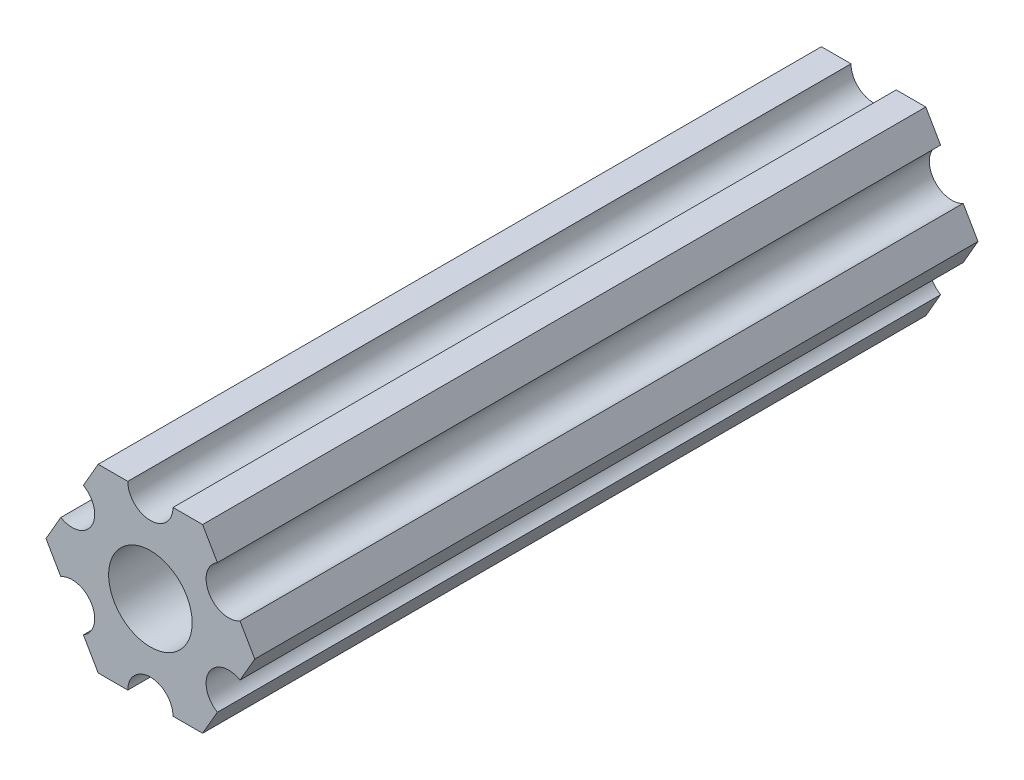
ISO-10303-21;
HEADER;
FILE_DESCRIPTION(('STEP AP214'),'2;1');
FILE_NAME('part.step','',(''),(''),'','','');
FILE_SCHEMA(('AUTOMOTIVE_DESIGN { 1 0 10303 214 1 1 1 1 }'));
ENDSEC;
DATA;
#1=APPLICATION_CONTEXT('core data for automotive mechanical design processes');
#2=APPLICATION_PROTOCOL_DEFINITION('international standard','automotive_design',2000,#1);
#3=PRODUCT_CONTEXT('',#1,'mechanical');
#4=PRODUCT('Part','Part','',(#3));
#5=PRODUCT_RELATED_PRODUCT_CATEGORY('part','',(#4));
#6=PRODUCT_DEFINITION_FORMATION('','',#4);
#7=PRODUCT_DEFINITION_CONTEXT('part definition',#1,'design');
#8=PRODUCT_DEFINITION('design','',#6,#7);
#9=PRODUCT_DEFINITION_SHAPE('','',#8);
#10=(LENGTH_UNIT() NAMED_UNIT(*) SI_UNIT(.MILLI.,.METRE.));
#11=(NAMED_UNIT(*) PLANE_ANGLE_UNIT() SI_UNIT($,.RADIAN.));
#12=(NAMED_UNIT(*) SI_UNIT($,.STERADIAN.) SOLID_ANGLE_UNIT());
#13=UNCERTAINTY_MEASURE_WITH_UNIT(LENGTH_MEASURE(1.E-05),#10,'distance_accuracy_value','');
#14=(GEOMETRIC_REPRESENTATION_CONTEXT(3) GLOBAL_UNCERTAINTY_ASSIGNED_CONTEXT((#13)) GLOBAL_UNIT_ASSIGNED_CONTEXT((#10,
#11,#12)) REPRESENTATION_CONTEXT('',''));
#15=CARTESIAN_POINT('',(0.,0.,0.));
#16=DIRECTION('',(0.,0.,1.));
#17=DIRECTION('',(1.,0.,0.));
#18=AXIS2_PLACEMENT_3D('',#15,#16,#17);
#19=CARTESIAN_POINT('',(5.49926150638083,-3.17499966684068,-50.8));
#20=DIRECTION('',(0.,0.,1.));
#21=DIRECTION('',(1.,0.,0.));
#22=AXIS2_PLACEMENT_3D('',#19,#20,#21);
#23=PLANE('',#22);
#24=CARTESIAN_POINT('',(5.49926150638083,-3.17499966684068,-50.8));
#25=DIRECTION('',(0.,0.,1.));
#26=DIRECTION('',(1.,0.,0.));
#27=AXIS2_PLACEMENT_3D('',#24,#25,#26);
#28=CIRCLE('',#27,1.58750000000001);
#29=CARTESIAN_POINT('',(6.29301142309098,-1.80018429024546,-50.8));
#30=VERTEX_POINT('',#29);
#31=CARTESIAN_POINT('',(4.70551158967068,-4.54981504343589,-50.8));
#32=VERTEX_POINT('',#31);
#33=EDGE_CURVE('E225',#30,#32,#28,.T.);
#34=ORIENTED_EDGE('',*,*,#33,.T.);
#35=DIRECTION('',(-0.499999947533953,-0.866025434075723,0.));
#36=VECTOR('',#35,1.);
#37=CARTESIAN_POINT('',(4.70551158967068,-4.54981504343589,-50.8));
#38=LINE('',#37,#36);
#39=CARTESIAN_POINT('',(3.66617452134693,-6.34999990382519,-50.8));
#40=VERTEX_POINT('',#39);
#41=EDGE_CURVE('E123',#32,#40,#38,.T.);
#42=ORIENTED_EDGE('',*,*,#41,.T.);
#43=DIRECTION('',(-1.,0.,0.));
#44=VECTOR('',#43,1.);
#45=CARTESIAN_POINT('',(3.66617452134693,-6.34999990382519,-50.8));
#46=LINE('',#45,#44);
#47=CARTESIAN_POINT('',(1.58750038469926,-6.34999990382518,-50.8));
#48=VERTEX_POINT('',#47);
#49=EDGE_CURVE('E270',#40,#48,#46,.T.);
#50=ORIENTED_EDGE('',*,*,#49,.T.);
#51=CARTESIAN_POINT('',(3.8469926204343E-07,-6.34999990382519,-50.8));
#52=DIRECTION('',(0.,0.,1.));
#53=DIRECTION('',(1.,0.,0.));
#54=AXIS2_PLACEMENT_3D('',#51,#52,#53);
#55=CIRCLE('',#54,1.5875);
#56=CARTESIAN_POINT('',(-1.58749961530074,-6.34999990382519,-50.8));
#57=VERTEX_POINT('',#56);
#58=EDGE_CURVE('E289',#48,#57,#55,.T.);
#59=ORIENTED_EDGE('',*,*,#58,.T.);
#60=DIRECTION('',(-1.,0.,0.));
#61=VECTOR('',#60,1.);
#62=CARTESIAN_POINT('',(-1.58749961530074,-6.34999990382519,-50.8));
#63=LINE('',#62,#61);
#64=CARTESIAN_POINT('',(-3.66617382465481,-6.34999990382519,-50.8));
#65=VERTEX_POINT('',#64);
#66=EDGE_CURVE('E286',#57,#65,#63,.T.);
#67=ORIENTED_EDGE('',*,*,#66,.T.);
#68=DIRECTION('',(-0.5,0.866025403784439,0.));
#69=VECTOR('',#68,1.);
#70=CARTESIAN_POINT('',(-3.66617382465481,-6.34999990382519,-50.8));
#71=LINE('',#70,#69);
#72=CARTESIAN_POINT('',(-4.70551092933191,-4.54981523233291,-50.8));
#73=VERTEX_POINT('',#72);
#74=EDGE_CURVE('E288',#65,#73,#71,.T.);
#75=ORIENTED_EDGE('',*,*,#74,.T.);
#76=CARTESIAN_POINT('',(-5.49926092933191,-3.17499990382512,-50.8));
#77=DIRECTION('',(0.,0.,1.));
#78=DIRECTION('',(1.,0.,0.));
#79=AXIS2_PLACEMENT_3D('',#76,#77,#78);
#80=CIRCLE('',#79,1.5875);
#81=CARTESIAN_POINT('',(-6.29301092933191,-1.80018457531732,-50.8));
#82=VERTEX_POINT('',#81);
#83=EDGE_CURVE('E291',#73,#82,#80,.T.);
#84=ORIENTED_EDGE('',*,*,#83,.T.);
#85=DIRECTION('',(-0.5,0.866025403784438,0.));
#86=VECTOR('',#85,1.);
#87=CARTESIAN_POINT('',(-6.29301092933191,-1.80018457531732,-50.8));
#88=LINE('',#87,#86);
#89=CARTESIAN_POINT('',(-7.33234803400895,9.61748368946088E-08,-50.8));
#90=VERTEX_POINT('',#89);
#91=EDGE_CURVE('E297',#82,#90,#88,.T.);
#92=ORIENTED_EDGE('',*,*,#91,.T.);
#93=DIRECTION('',(0.499999921300922,0.866025449221368,0.));
#94=VECTOR('',#93,1.);
#95=CARTESIAN_POINT('',(-7.33234803400895,9.61748368946088E-08,-50.8));
#96=LINE('',#95,#94);
#97=CARTESIAN_POINT('',(-6.29301117773375,1.80018471521667,-50.8));
#98=VERTEX_POINT('',#97);
#99=EDGE_CURVE('E299',#90,#98,#96,.T.);
#100=ORIENTED_EDGE('',*,*,#99,.T.);
#101=CARTESIAN_POINT('',(-5.49926130266854,3.1750001158556,-50.8));
#102=DIRECTION('',(0.,0.,1.));
#103=DIRECTION('',(1.,0.,0.));
#104=AXIS2_PLACEMENT_3D('',#101,#102,#103);
#105=CIRCLE('',#104,1.5875);
#106=CARTESIAN_POINT('',(-4.70551142760333,4.54981551649452,-50.8));
#107=VERTEX_POINT('',#106);
#108=EDGE_CURVE('E301',#98,#107,#105,.T.);
#109=ORIENTED_EDGE('',*,*,#108,.T.);
#110=DIRECTION('',(0.499999921300922,0.866025449221368,0.));
#111=VECTOR('',#110,1.);
#112=CARTESIAN_POINT('',(-4.70551142760333,4.54981551649452,-50.8));
#113=LINE('',#112,#111);
#114=CARTESIAN_POINT('',(-3.66617452134701,6.35000022210623,-50.8));
#115=VERTEX_POINT('',#114);
#116=EDGE_CURVE('E303',#107,#115,#113,.T.);
#117=ORIENTED_EDGE('',*,*,#116,.T.);
#118=DIRECTION('',(1.,0.,0.));
#119=VECTOR('',#118,1.);
#120=CARTESIAN_POINT('',(-3.66617452134701,6.35000022210623,-50.8));
#121=LINE('',#120,#119);
#122=CARTESIAN_POINT('',(-1.58750038469935,6.35000022210623,-50.8));
#123=VERTEX_POINT('',#122);
#124=EDGE_CURVE('E305',#115,#123,#121,.T.);
#125=ORIENTED_EDGE('',*,*,#124,.T.);
#126=CARTESIAN_POINT('',(-3.84699344941095E-07,6.35000022210623,-50.8));
#127=DIRECTION('',(0.,0.,1.));
#128=DIRECTION('',(1.,0.,0.));
#129=AXIS2_PLACEMENT_3D('',#126,#127,#128);
#130=CIRCLE('',#129,1.5875);
#131=CARTESIAN_POINT('',(1.58749961530066,6.35000022210623,-50.8));
#132=VERTEX_POINT('',#131);
#133=EDGE_CURVE('E307',#123,#132,#130,.T.);
#134=ORIENTED_EDGE('',*,*,#133,.T.);
#135=DIRECTION('',(1.,0.,0.));
#136=VECTOR('',#135,1.);
#137=CARTESIAN_POINT('',(1.58749961530066,6.35000022210623,-50.8));
#138=LINE('',#137,#136);
#139=CARTESIAN_POINT('',(3.66617382465472,6.35000022210622,-50.8));
#140=VERTEX_POINT('',#139);
#141=EDGE_CURVE('E309',#132,#140,#138,.T.);
#142=ORIENTED_EDGE('',*,*,#141,.T.);
#143=DIRECTION('',(0.500000052466056,-0.866025373493145,0.));
#144=VECTOR('',#143,1.);
#145=CARTESIAN_POINT('',(3.66617382465472,6.35000022210622,-50.8));
#146=LINE('',#145,#144);
#147=CARTESIAN_POINT('',(4.70551103839166,4.54981561357968,-50.8));
#148=VERTEX_POINT('',#147);
#149=EDGE_CURVE('E172',#140,#148,#146,.T.);
#150=ORIENTED_EDGE('',*,*,#149,.T.);
#151=CARTESIAN_POINT('',(5.49926112168152,3.17500033315931,-50.8));
#152=DIRECTION('',(0.,0.,1.));
#153=DIRECTION('',(1.,0.,0.));
#154=AXIS2_PLACEMENT_3D('',#151,#152,#153);
#155=CIRCLE('',#154,1.5875);
#156=CARTESIAN_POINT('',(6.29301120497139,1.80018505273895,-50.8));
#157=VERTEX_POINT('',#156);
#158=EDGE_CURVE('E166',#148,#157,#155,.T.);
#159=ORIENTED_EDGE('',*,*,#158,.T.);
#160=DIRECTION('',(0.500000052466056,-0.866025373493145,0.));
#161=VECTOR('',#160,1.);
#162=CARTESIAN_POINT('',(6.29301120497139,1.80018505273895,-50.8));
#163=LINE('',#162,#161);
#164=CARTESIAN_POINT('',(7.33234841870826,4.44212518856872E-07,-50.8));
#165=VERTEX_POINT('',#164);
#166=EDGE_CURVE('E170',#157,#165,#163,.T.);
#167=ORIENTED_EDGE('',*,*,#166,.T.);
#168=DIRECTION('',(-0.499999947533953,-0.866025434075723,0.));
#169=VECTOR('',#168,1.);
#170=CARTESIAN_POINT('',(7.33234841870826,4.44212518856872E-07,-50.8));
#171=LINE('',#170,#169);
#172=EDGE_CURVE('E50',#165,#30,#171,.T.);
#173=ORIENTED_EDGE('',*,*,#172,.T.);
#174=EDGE_LOOP('',(#34,#42,#50,#59,#67,#75,#84,#92,#100,#109,#117,#125,#134,#142,#150,#159,#167,#173));
#175=FACE_BOUND('',#174,.T.);
#176=CARTESIAN_POINT('',(0.,0.,-50.8));
#177=DIRECTION('',(0.,0.,-1.));
#178=DIRECTION('',(1.,0.,0.));
#179=AXIS2_PLACEMENT_3D('',#176,#177,#178);
#180=CIRCLE('',#179,2.9337);
#181=CARTESIAN_POINT('',(2.9337,0.,-50.8));
#182=VERTEX_POINT('',#181);
#183=EDGE_CURVE('E194',#182,#182,#180,.T.);
#184=ORIENTED_EDGE('',*,*,#183,.F.);
#185=EDGE_LOOP('',(#184));
#186=FACE_BOUND('',#185,.T.);
#187=ADVANCED_FACE('F33',(#175,#186),#23,.F.);
#188=CARTESIAN_POINT('',(5.49926150638083,-3.17499966684068,0.));
#189=DIRECTION('',(0.,0.,1.));
#190=DIRECTION('',(1.,0.,0.));
#191=AXIS2_PLACEMENT_3D('',#188,#189,#190);
#192=PLANE('',#191);
#193=CARTESIAN_POINT('',(5.49926150638083,-3.17499966684068,0.));
#194=DIRECTION('',(0.,0.,1.));
#195=DIRECTION('',(1.,0.,0.));
#196=AXIS2_PLACEMENT_3D('',#193,#194,#195);
#197=CIRCLE('',#196,1.58750000000001);
#198=CARTESIAN_POINT('',(6.29301142309098,-1.80018429024546,0.));
#199=VERTEX_POINT('',#198);
#200=CARTESIAN_POINT('',(4.70551158967068,-4.54981504343589,0.));
#201=VERTEX_POINT('',#200);
#202=EDGE_CURVE('E190',#199,#201,#197,.T.);
#203=ORIENTED_EDGE('',*,*,#202,.F.);
#204=DIRECTION('',(-0.499999947533953,-0.866025434075723,0.));
#205=VECTOR('',#204,1.);
#206=CARTESIAN_POINT('',(7.33234841870826,4.44212518856872E-07,0.));
#207=LINE('',#206,#205);
#208=CARTESIAN_POINT('',(7.33234841870826,4.44212518856872E-07,0.));
#209=VERTEX_POINT('',#208);
#210=EDGE_CURVE('E115',#209,#199,#207,.T.);
#211=ORIENTED_EDGE('',*,*,#210,.F.);
#212=DIRECTION('',(0.500000052466056,-0.866025373493145,0.));
#213=VECTOR('',#212,1.);
#214=CARTESIAN_POINT('',(6.29301120497139,1.80018505273895,0.));
#215=LINE('',#214,#213);
#216=CARTESIAN_POINT('',(6.29301120497139,1.80018505273895,0.));
#217=VERTEX_POINT('',#216);
#218=EDGE_CURVE('E109',#217,#209,#215,.T.);
#219=ORIENTED_EDGE('',*,*,#218,.F.);
#220=CARTESIAN_POINT('',(5.49926112168152,3.17500033315931,0.));
#221=DIRECTION('',(0.,0.,1.));
#222=DIRECTION('',(1.,0.,0.));
#223=AXIS2_PLACEMENT_3D('',#220,#221,#222);
#224=CIRCLE('',#223,1.5875);
#225=CARTESIAN_POINT('',(4.70551103839166,4.54981561357968,0.));
#226=VERTEX_POINT('',#225);
#227=EDGE_CURVE('E180',#226,#217,#224,.T.);
#228=ORIENTED_EDGE('',*,*,#227,.F.);
#229=DIRECTION('',(0.500000052466056,-0.866025373493145,0.));
#230=VECTOR('',#229,1.);
#231=CARTESIAN_POINT('',(3.66617382465472,6.35000022210622,0.));
#232=LINE('',#231,#230);
#233=CARTESIAN_POINT('',(3.66617382465472,6.35000022210622,0.));
#234=VERTEX_POINT('',#233);
#235=EDGE_CURVE('E220',#234,#226,#232,.T.);
#236=ORIENTED_EDGE('',*,*,#235,.F.);
#237=DIRECTION('',(1.,0.,0.));
#238=VECTOR('',#237,1.);
#239=CARTESIAN_POINT('',(1.58749961530066,6.35000022210623,0.));
#240=LINE('',#239,#238);
#241=CARTESIAN_POINT('',(1.58749961530066,6.35000022210623,0.));
#242=VERTEX_POINT('',#241);
#243=EDGE_CURVE('E218',#242,#234,#240,.T.);
#244=ORIENTED_EDGE('',*,*,#243,.F.);
#245=CARTESIAN_POINT('',(-3.84699344941095E-07,6.35000022210623,0.));
#246=DIRECTION('',(0.,0.,1.));
#247=DIRECTION('',(1.,0.,0.));
#248=AXIS2_PLACEMENT_3D('',#245,#246,#247);
#249=CIRCLE('',#248,1.5875);
#250=CARTESIAN_POINT('',(-1.58750038469935,6.35000022210623,0.));
#251=VERTEX_POINT('',#250);
#252=EDGE_CURVE('E216',#251,#242,#249,.T.);
#253=ORIENTED_EDGE('',*,*,#252,.F.);
#254=DIRECTION('',(1.,0.,0.));
#255=VECTOR('',#254,1.);
#256=CARTESIAN_POINT('',(-3.66617452134701,6.35000022210623,0.));
#257=LINE('',#256,#255);
#258=CARTESIAN_POINT('',(-3.66617452134701,6.35000022210623,0.));
#259=VERTEX_POINT('',#258);
#260=EDGE_CURVE('E214',#259,#251,#257,.T.);
#261=ORIENTED_EDGE('',*,*,#260,.F.);
#262=DIRECTION('',(0.499999921300922,0.866025449221368,0.));
#263=VECTOR('',#262,1.);
#264=CARTESIAN_POINT('',(-4.70551142760333,4.54981551649452,0.));
#265=LINE('',#264,#263);
#266=CARTESIAN_POINT('',(-4.70551142760333,4.54981551649452,0.));
#267=VERTEX_POINT('',#266);
#268=EDGE_CURVE('E212',#267,#259,#265,.T.);
#269=ORIENTED_EDGE('',*,*,#268,.F.);
#270=CARTESIAN_POINT('',(-5.49926130266854,3.1750001158556,0.));
#271=DIRECTION('',(0.,0.,1.));
#272=DIRECTION('',(1.,0.,0.));
#273=AXIS2_PLACEMENT_3D('',#270,#271,#272);
#274=CIRCLE('',#273,1.5875);
#275=CARTESIAN_POINT('',(-6.29301117773375,1.80018471521667,0.));
#276=VERTEX_POINT('',#275);
#277=EDGE_CURVE('E210',#276,#267,#274,.T.);
#278=ORIENTED_EDGE('',*,*,#277,.F.);
#279=DIRECTION('',(0.499999921300922,0.866025449221368,0.));
#280=VECTOR('',#279,1.);
#281=CARTESIAN_POINT('',(-7.33234803400895,9.61748368946088E-08,0.));
#282=LINE('',#281,#280);
#283=CARTESIAN_POINT('',(-7.33234803400895,9.61748368946088E-08,0.));
#284=VERTEX_POINT('',#283);
#285=EDGE_CURVE('E208',#284,#276,#282,.T.);
#286=ORIENTED_EDGE('',*,*,#285,.F.);
#287=DIRECTION('',(-0.5,0.866025403784438,0.));
#288=VECTOR('',#287,1.);
#289=CARTESIAN_POINT('',(-6.29301092933191,-1.80018457531732,0.));
#290=LINE('',#289,#288);
#291=CARTESIAN_POINT('',(-6.29301092933191,-1.80018457531732,0.));
#292=VERTEX_POINT('',#291);
#293=EDGE_CURVE('E206',#292,#284,#290,.T.);
#294=ORIENTED_EDGE('',*,*,#293,.F.);
#295=CARTESIAN_POINT('',(-5.49926092933191,-3.17499990382512,0.));
#296=DIRECTION('',(0.,0.,1.));
#297=DIRECTION('',(1.,0.,0.));
#298=AXIS2_PLACEMENT_3D('',#295,#296,#297);
#299=CIRCLE('',#298,1.5875);
#300=CARTESIAN_POINT('',(-4.70551092933191,-4.54981523233291,0.));
#301=VERTEX_POINT('',#300);
#302=EDGE_CURVE('E204',#301,#292,#299,.T.);
#303=ORIENTED_EDGE('',*,*,#302,.F.);
#304=DIRECTION('',(-0.5,0.866025403784439,0.));
#305=VECTOR('',#304,1.);
#306=CARTESIAN_POINT('',(-3.66617382465481,-6.34999990382519,0.));
#307=LINE('',#306,#305);
#308=CARTESIAN_POINT('',(-3.66617382465481,-6.34999990382519,0.));
#309=VERTEX_POINT('',#308);
#310=EDGE_CURVE('E202',#309,#301,#307,.T.);
#311=ORIENTED_EDGE('',*,*,#310,.F.);
#312=DIRECTION('',(-1.,0.,0.));
#313=VECTOR('',#312,1.);
#314=CARTESIAN_POINT('',(-1.58749961530074,-6.34999990382519,0.));
#315=LINE('',#314,#313);
#316=CARTESIAN_POINT('',(-1.58749961530074,-6.34999990382519,0.));
#317=VERTEX_POINT('',#316);
#318=EDGE_CURVE('E200',#317,#309,#315,.T.);
#319=ORIENTED_EDGE('',*,*,#318,.F.);
#320=CARTESIAN_POINT('',(3.8469926204343E-07,-6.34999990382519,0.));
#321=DIRECTION('',(0.,0.,1.));
#322=DIRECTION('',(1.,0.,0.));
#323=AXIS2_PLACEMENT_3D('',#320,#321,#322);
#324=CIRCLE('',#323,1.5875);
#325=CARTESIAN_POINT('',(1.58750038469926,-6.34999990382518,0.));
#326=VERTEX_POINT('',#325);
#327=EDGE_CURVE('E198',#326,#317,#324,.T.);
#328=ORIENTED_EDGE('',*,*,#327,.F.);
#329=DIRECTION('',(-1.,0.,0.));
#330=VECTOR('',#329,1.);
#331=CARTESIAN_POINT('',(3.66617452134693,-6.34999990382519,0.));
#332=LINE('',#331,#330);
#333=CARTESIAN_POINT('',(3.66617452134693,-6.34999990382519,0.));
#334=VERTEX_POINT('',#333);
#335=EDGE_CURVE('E196',#334,#326,#332,.T.);
#336=ORIENTED_EDGE('',*,*,#335,.F.);
#337=DIRECTION('',(-0.499999947533953,-0.866025434075723,0.));
#338=VECTOR('',#337,1.);
#339=CARTESIAN_POINT('',(4.70551158967068,-4.54981504343589,0.));
#340=LINE('',#339,#338);
#341=EDGE_CURVE('E193',#201,#334,#340,.T.);
#342=ORIENTED_EDGE('',*,*,#341,.F.);
#343=EDGE_LOOP('',(#203,#211,#219,#228,#236,#244,#253,#261,#269,#278,#286,#294,#303,#311,#319,
#328,#336,#342));
#344=FACE_BOUND('',#343,.T.);
#345=CARTESIAN_POINT('',(0.,0.,0.));
#346=DIRECTION('',(0.,0.,-1.));
#347=DIRECTION('',(1.,0.,0.));
#348=AXIS2_PLACEMENT_3D('',#345,#346,#347);
#349=CIRCLE('',#348,2.9337);
#350=CARTESIAN_POINT('',(2.9337,0.,0.));
#351=VERTEX_POINT('',#350);
#352=EDGE_CURVE('E534',#351,#351,#349,.T.);
#353=ORIENTED_EDGE('',*,*,#352,.T.);
#354=EDGE_LOOP('',(#353));
#355=FACE_BOUND('',#354,.T.);
#356=ADVANCED_FACE('F274',(#344,#355),#192,.T.);
#357=CARTESIAN_POINT('',(5.49926150638083,-3.17499966684068,-50.8));
#358=DIRECTION('',(0.,0.,1.));
#359=DIRECTION('',(1.,0.,0.));
#360=AXIS2_PLACEMENT_3D('',#357,#358,#359);
#361=CYLINDRICAL_SURFACE('',#360,1.58750000000001);
#362=ORIENTED_EDGE('',*,*,#202,.T.);
#363=DIRECTION('',(0.,0.,1.));
#364=VECTOR('',#363,1.);
#365=CARTESIAN_POINT('',(4.70551158967068,-4.54981504343589,-50.8));
#366=LINE('',#365,#364);
#367=EDGE_CURVE('E11',#32,#201,#366,.T.);
#368=ORIENTED_EDGE('',*,*,#367,.F.);
#369=ORIENTED_EDGE('',*,*,#33,.F.);
#370=DIRECTION('',(0.,0.,1.));
#371=VECTOR('',#370,1.);
#372=CARTESIAN_POINT('',(6.29301142309098,-1.80018429024546,-50.8));
#373=LINE('',#372,#371);
#374=EDGE_CURVE('E186',#30,#199,#373,.T.);
#375=ORIENTED_EDGE('',*,*,#374,.T.);
#376=EDGE_LOOP('',(#362,#368,#369,#375));
#377=FACE_BOUND('',#376,.T.);
#378=ADVANCED_FACE('F35',(#377),#361,.F.);
#379=CARTESIAN_POINT('',(4.70551158967068,-4.54981504343589,-50.8));
#380=DIRECTION('',(-0.866025434075723,0.499999947533953,0.));
#381=DIRECTION('',(-0.499999947533953,-0.866025434075723,0.));
#382=AXIS2_PLACEMENT_3D('',#379,#380,#381);
#383=PLANE('',#382);
#384=ORIENTED_EDGE('',*,*,#341,.T.);
#385=DIRECTION('',(0.,0.,1.));
#386=VECTOR('',#385,1.);
#387=CARTESIAN_POINT('',(3.66617452134693,-6.34999990382519,-50.8));
#388=LINE('',#387,#386);
#389=EDGE_CURVE('E42',#40,#334,#388,.T.);
#390=ORIENTED_EDGE('',*,*,#389,.F.);
#391=ORIENTED_EDGE('',*,*,#41,.F.);
#392=ORIENTED_EDGE('',*,*,#367,.T.);
#393=EDGE_LOOP('',(#384,#390,#391,#392));
#394=FACE_BOUND('',#393,.T.);
#395=ADVANCED_FACE('F343',(#394),#383,.F.);
#396=CARTESIAN_POINT('',(3.66617452134693,-6.34999990382519,-50.8));
#397=DIRECTION('',(0.,1.,0.));
#398=DIRECTION('',(-1.,0.,0.));
#399=AXIS2_PLACEMENT_3D('',#396,#397,#398);
#400=PLANE('',#399);
#401=ORIENTED_EDGE('',*,*,#335,.T.);
#402=DIRECTION('',(0.,0.,1.));
#403=VECTOR('',#402,1.);
#404=CARTESIAN_POINT('',(1.58750038469926,-6.34999990382518,-50.8));
#405=LINE('',#404,#403);
#406=EDGE_CURVE('E262',#48,#326,#405,.T.);
#407=ORIENTED_EDGE('',*,*,#406,.F.);
#408=ORIENTED_EDGE('',*,*,#49,.F.);
#409=ORIENTED_EDGE('',*,*,#389,.T.);
#410=EDGE_LOOP('',(#401,#407,#408,#409));
#411=FACE_BOUND('',#410,.T.);
#412=ADVANCED_FACE('F268',(#411),#400,.F.);
#413=CARTESIAN_POINT('',(3.8469926204343E-07,-6.34999990382519,-50.8));
#414=DIRECTION('',(0.,0.,1.));
#415=DIRECTION('',(1.,0.,0.));
#416=AXIS2_PLACEMENT_3D('',#413,#414,#415);
#417=CYLINDRICAL_SURFACE('',#416,1.5875);
#418=ORIENTED_EDGE('',*,*,#327,.T.);
#419=DIRECTION('',(0.,0.,1.));
#420=VECTOR('',#419,1.);
#421=CARTESIAN_POINT('',(-1.58749961530074,-6.34999990382519,-50.8));
#422=LINE('',#421,#420);
#423=EDGE_CURVE('E259',#57,#317,#422,.T.);
#424=ORIENTED_EDGE('',*,*,#423,.F.);
#425=ORIENTED_EDGE('',*,*,#58,.F.);
#426=ORIENTED_EDGE('',*,*,#406,.T.);
#427=EDGE_LOOP('',(#418,#424,#425,#426));
#428=FACE_BOUND('',#427,.T.);
#429=ADVANCED_FACE('F280',(#428),#417,.F.);
#430=CARTESIAN_POINT('',(-1.58749961530074,-6.34999990382519,-50.8));
#431=DIRECTION('',(0.,1.,0.));
#432=DIRECTION('',(-1.,0.,0.));
#433=AXIS2_PLACEMENT_3D('',#430,#431,#432);
#434=PLANE('',#433);
#435=ORIENTED_EDGE('',*,*,#318,.T.);
#436=DIRECTION('',(0.,0.,1.));
#437=VECTOR('',#436,1.);
#438=CARTESIAN_POINT('',(-3.66617382465481,-6.34999990382519,-50.8));
#439=LINE('',#438,#437);
#440=EDGE_CURVE('E256',#65,#309,#439,.T.);
#441=ORIENTED_EDGE('',*,*,#440,.F.);
#442=ORIENTED_EDGE('',*,*,#66,.F.);
#443=ORIENTED_EDGE('',*,*,#423,.T.);
#444=EDGE_LOOP('',(#435,#441,#442,#443));
#445=FACE_BOUND('',#444,.T.);
#446=ADVANCED_FACE('F284',(#445),#434,.F.);
#447=CARTESIAN_POINT('',(-3.66617382465481,-6.34999990382519,-50.8));
#448=DIRECTION('',(0.866025403784438,0.5,0.));
#449=DIRECTION('',(-0.5,0.866025403784439,0.));
#450=AXIS2_PLACEMENT_3D('',#447,#448,#449);
#451=PLANE('',#450);
#452=ORIENTED_EDGE('',*,*,#310,.T.);
#453=DIRECTION('',(0.,0.,1.));
#454=VECTOR('',#453,1.);
#455=CARTESIAN_POINT('',(-4.70551092933191,-4.54981523233291,-50.8));
#456=LINE('',#455,#454);
#457=EDGE_CURVE('E253',#73,#301,#456,.T.);
#458=ORIENTED_EDGE('',*,*,#457,.F.);
#459=ORIENTED_EDGE('',*,*,#74,.F.);
#460=ORIENTED_EDGE('',*,*,#440,.T.);
#461=EDGE_LOOP('',(#452,#458,#459,#460));
#462=FACE_BOUND('',#461,.T.);
#463=ADVANCED_FACE('F356',(#462),#451,.F.);
#464=CARTESIAN_POINT('',(-5.49926092933191,-3.17499990382512,-50.8));
#465=DIRECTION('',(0.,0.,1.));
#466=DIRECTION('',(1.,0.,0.));
#467=AXIS2_PLACEMENT_3D('',#464,#465,#466);
#468=CYLINDRICAL_SURFACE('',#467,1.5875);
#469=ORIENTED_EDGE('',*,*,#302,.T.);
#470=DIRECTION('',(0.,0.,1.));
#471=VECTOR('',#470,1.);
#472=CARTESIAN_POINT('',(-6.29301092933191,-1.80018457531732,-50.8));
#473=LINE('',#472,#471);
#474=EDGE_CURVE('E250',#82,#292,#473,.T.);
#475=ORIENTED_EDGE('',*,*,#474,.F.);
#476=ORIENTED_EDGE('',*,*,#83,.F.);
#477=ORIENTED_EDGE('',*,*,#457,.T.);
#478=EDGE_LOOP('',(#469,#475,#476,#477));
#479=FACE_BOUND('',#478,.T.);
#480=ADVANCED_FACE('F359',(#479),#468,.F.);
#481=CARTESIAN_POINT('',(-6.29301092933191,-1.80018457531732,-50.8));
#482=DIRECTION('',(0.866025403784438,0.5,0.));
#483=DIRECTION('',(-0.5,0.866025403784438,0.));
#484=AXIS2_PLACEMENT_3D('',#481,#482,#483);
#485=PLANE('',#484);
#486=ORIENTED_EDGE('',*,*,#293,.T.);
#487=DIRECTION('',(0.,0.,1.));
#488=VECTOR('',#487,1.);
#489=CARTESIAN_POINT('',(-7.33234803400895,9.61748368946088E-08,-50.8));
#490=LINE('',#489,#488);
#491=EDGE_CURVE('E247',#90,#284,#490,.T.);
#492=ORIENTED_EDGE('',*,*,#491,.F.);
#493=ORIENTED_EDGE('',*,*,#91,.F.);
#494=ORIENTED_EDGE('',*,*,#474,.T.);
#495=EDGE_LOOP('',(#486,#492,#493,#494));
#496=FACE_BOUND('',#495,.T.);
#497=ADVANCED_FACE('F363',(#496),#485,.F.);
#498=CARTESIAN_POINT('',(-7.33234803400895,9.61748368946088E-08,-50.8));
#499=DIRECTION('',(0.866025449221368,-0.499999921300922,0.));
#500=DIRECTION('',(0.499999921300922,0.866025449221368,0.));
#501=AXIS2_PLACEMENT_3D('',#498,#499,#500);
#502=PLANE('',#501);
#503=ORIENTED_EDGE('',*,*,#285,.T.);
#504=DIRECTION('',(0.,0.,1.));
#505=VECTOR('',#504,1.);
#506=CARTESIAN_POINT('',(-6.29301117773375,1.80018471521667,-50.8));
#507=LINE('',#506,#505);
#508=EDGE_CURVE('E244',#98,#276,#507,.T.);
#509=ORIENTED_EDGE('',*,*,#508,.F.);
#510=ORIENTED_EDGE('',*,*,#99,.F.);
#511=ORIENTED_EDGE('',*,*,#491,.T.);
#512=EDGE_LOOP('',(#503,#509,#510,#511));
#513=FACE_BOUND('',#512,.T.);
#514=ADVANCED_FACE('F367',(#513),#502,.F.);
#515=CARTESIAN_POINT('',(-5.49926130266854,3.1750001158556,-50.8));
#516=DIRECTION('',(0.,0.,1.));
#517=DIRECTION('',(1.,0.,0.));
#518=AXIS2_PLACEMENT_3D('',#515,#516,#517);
#519=CYLINDRICAL_SURFACE('',#518,1.5875);
#520=ORIENTED_EDGE('',*,*,#277,.T.);
#521=DIRECTION('',(0.,0.,1.));
#522=VECTOR('',#521,1.);
#523=CARTESIAN_POINT('',(-4.70551142760333,4.54981551649452,-50.8));
#524=LINE('',#523,#522);
#525=EDGE_CURVE('E241',#107,#267,#524,.T.);
#526=ORIENTED_EDGE('',*,*,#525,.F.);
#527=ORIENTED_EDGE('',*,*,#108,.F.);
#528=ORIENTED_EDGE('',*,*,#508,.T.);
#529=EDGE_LOOP('',(#520,#526,#527,#528));
#530=FACE_BOUND('',#529,.T.);
#531=ADVANCED_FACE('F371',(#530),#519,.F.);
#532=CARTESIAN_POINT('',(-4.70551142760333,4.54981551649452,-50.8));
#533=DIRECTION('',(0.866025449221368,-0.499999921300922,0.));
#534=DIRECTION('',(0.499999921300922,0.866025449221368,0.));
#535=AXIS2_PLACEMENT_3D('',#532,#533,#534);
#536=PLANE('',#535);
#537=ORIENTED_EDGE('',*,*,#268,.T.);
#538=DIRECTION('',(0.,0.,1.));
#539=VECTOR('',#538,1.);
#540=CARTESIAN_POINT('',(-3.66617452134701,6.35000022210623,-50.8));
#541=LINE('',#540,#539);
#542=EDGE_CURVE('E238',#115,#259,#541,.T.);
#543=ORIENTED_EDGE('',*,*,#542,.F.);
#544=ORIENTED_EDGE('',*,*,#116,.F.);
#545=ORIENTED_EDGE('',*,*,#525,.T.);
#546=EDGE_LOOP('',(#537,#543,#544,#545));
#547=FACE_BOUND('',#546,.T.);
#548=ADVANCED_FACE('F375',(#547),#536,.F.);
#549=CARTESIAN_POINT('',(-3.66617452134701,6.35000022210623,-50.8));
#550=DIRECTION('',(0.,-1.,0.));
#551=DIRECTION('',(0.,0.,-1.));
#552=AXIS2_PLACEMENT_3D('',#549,#550,#551);
#553=PLANE('',#552);
#554=ORIENTED_EDGE('',*,*,#260,.T.);
#555=DIRECTION('',(0.,0.,1.));
#556=VECTOR('',#555,1.);
#557=CARTESIAN_POINT('',(-1.58750038469935,6.35000022210623,-50.8));
#558=LINE('',#557,#556);
#559=EDGE_CURVE('E235',#123,#251,#558,.T.);
#560=ORIENTED_EDGE('',*,*,#559,.F.);
#561=ORIENTED_EDGE('',*,*,#124,.F.);
#562=ORIENTED_EDGE('',*,*,#542,.T.);
#563=EDGE_LOOP('',(#554,#560,#561,#562));
#564=FACE_BOUND('',#563,.T.);
#565=ADVANCED_FACE('F379',(#564),#553,.F.);
#566=CARTESIAN_POINT('',(-3.84699344941095E-07,6.35000022210623,-50.8));
#567=DIRECTION('',(0.,0.,1.));
#568=DIRECTION('',(1.,0.,0.));
#569=AXIS2_PLACEMENT_3D('',#566,#567,#568);
#570=CYLINDRICAL_SURFACE('',#569,1.5875);
#571=ORIENTED_EDGE('',*,*,#252,.T.);
#572=DIRECTION('',(0.,0.,1.));
#573=VECTOR('',#572,1.);
#574=CARTESIAN_POINT('',(1.58749961530066,6.35000022210623,-50.8));
#575=LINE('',#574,#573);
#576=EDGE_CURVE('E232',#132,#242,#575,.T.);
#577=ORIENTED_EDGE('',*,*,#576,.F.);
#578=ORIENTED_EDGE('',*,*,#133,.F.);
#579=ORIENTED_EDGE('',*,*,#559,.T.);
#580=EDGE_LOOP('',(#571,#577,#578,#579));
#581=FACE_BOUND('',#580,.T.);
#582=ADVANCED_FACE('F383',(#581),#570,.F.);
#583=CARTESIAN_POINT('',(1.58749961530066,6.35000022210623,-50.8));
#584=DIRECTION('',(0.,-1.,0.));
#585=DIRECTION('',(1.,0.,0.));
#586=AXIS2_PLACEMENT_3D('',#583,#584,#585);
#587=PLANE('',#586);
#588=ORIENTED_EDGE('',*,*,#243,.T.);
#589=DIRECTION('',(0.,0.,1.));
#590=VECTOR('',#589,1.);
#591=CARTESIAN_POINT('',(3.66617382465472,6.35000022210622,-50.8));
#592=LINE('',#591,#590);
#593=EDGE_CURVE('E229',#140,#234,#592,.T.);
#594=ORIENTED_EDGE('',*,*,#593,.F.);
#595=ORIENTED_EDGE('',*,*,#141,.F.);
#596=ORIENTED_EDGE('',*,*,#576,.T.);
#597=EDGE_LOOP('',(#588,#594,#595,#596));
#598=FACE_BOUND('',#597,.T.);
#599=ADVANCED_FACE('F315',(#598),#587,.F.);
#600=CARTESIAN_POINT('',(3.66617382465472,6.35000022210622,-50.8));
#601=DIRECTION('',(-0.866025373493145,-0.500000052466056,0.));
#602=DIRECTION('',(0.500000052466056,-0.866025373493145,0.));
#603=AXIS2_PLACEMENT_3D('',#600,#601,#602);
#604=PLANE('',#603);
#605=ORIENTED_EDGE('',*,*,#235,.T.);
#606=DIRECTION('',(0.,0.,1.));
#607=VECTOR('',#606,1.);
#608=CARTESIAN_POINT('',(4.70551103839166,4.54981561357968,-50.8));
#609=LINE('',#608,#607);
#610=EDGE_CURVE('E181',#148,#226,#609,.T.);
#611=ORIENTED_EDGE('',*,*,#610,.F.);
#612=ORIENTED_EDGE('',*,*,#149,.F.);
#613=ORIENTED_EDGE('',*,*,#593,.T.);
#614=EDGE_LOOP('',(#605,#611,#612,#613));
#615=FACE_BOUND('',#614,.T.);
#616=ADVANCED_FACE('F319',(#615),#604,.F.);
#617=CARTESIAN_POINT('',(5.49926112168152,3.17500033315931,-50.8));
#618=DIRECTION('',(0.,0.,1.));
#619=DIRECTION('',(1.,0.,0.));
#620=AXIS2_PLACEMENT_3D('',#617,#618,#619);
#621=CYLINDRICAL_SURFACE('',#620,1.5875);
#622=ORIENTED_EDGE('',*,*,#227,.T.);
#623=DIRECTION('',(0.,0.,1.));
#624=VECTOR('',#623,1.);
#625=CARTESIAN_POINT('',(6.29301120497139,1.80018505273895,-50.8));
#626=LINE('',#625,#624);
#627=EDGE_CURVE('E177',#157,#217,#626,.T.);
#628=ORIENTED_EDGE('',*,*,#627,.F.);
#629=ORIENTED_EDGE('',*,*,#158,.F.);
#630=ORIENTED_EDGE('',*,*,#610,.T.);
#631=EDGE_LOOP('',(#622,#628,#629,#630));
#632=FACE_BOUND('',#631,.T.);
#633=ADVANCED_FACE('F178',(#632),#621,.F.);
#634=CARTESIAN_POINT('',(6.29301120497139,1.80018505273895,-50.8));
#635=DIRECTION('',(-0.866025373493145,-0.500000052466056,0.));
#636=DIRECTION('',(0.500000052466056,-0.866025373493145,0.));
#637=AXIS2_PLACEMENT_3D('',#634,#635,#636);
#638=PLANE('',#637);
#639=ORIENTED_EDGE('',*,*,#218,.T.);
#640=DIRECTION('',(0.,0.,1.));
#641=VECTOR('',#640,1.);
#642=CARTESIAN_POINT('',(7.33234841870826,4.44212518856872E-07,-50.8));
#643=LINE('',#642,#641);
#644=EDGE_CURVE('E182',#165,#209,#643,.T.);
#645=ORIENTED_EDGE('',*,*,#644,.F.);
#646=ORIENTED_EDGE('',*,*,#166,.F.);
#647=ORIENTED_EDGE('',*,*,#627,.T.);
#648=EDGE_LOOP('',(#639,#645,#646,#647));
#649=FACE_BOUND('',#648,.T.);
#650=ADVANCED_FACE('F184',(#649),#638,.F.);
#651=CARTESIAN_POINT('',(7.33234841870826,4.44212518856872E-07,-50.8));
#652=DIRECTION('',(-0.866025434075723,0.499999947533953,0.));
#653=DIRECTION('',(-0.499999947533953,-0.866025434075723,0.));
#654=AXIS2_PLACEMENT_3D('',#651,#652,#653);
#655=PLANE('',#654);
#656=ORIENTED_EDGE('',*,*,#210,.T.);
#657=ORIENTED_EDGE('',*,*,#374,.F.);
#658=ORIENTED_EDGE('',*,*,#172,.F.);
#659=ORIENTED_EDGE('',*,*,#644,.T.);
#660=EDGE_LOOP('',(#656,#657,#658,#659));
#661=FACE_BOUND('',#660,.T.);
#662=ADVANCED_FACE('F323',(#661),#655,.F.);
#663=CARTESIAN_POINT('',(0.,0.,-50.8));
#664=DIRECTION('',(0.,0.,1.));
#665=DIRECTION('',(1.,0.,0.));
#666=AXIS2_PLACEMENT_3D('',#663,#664,#665);
#667=CYLINDRICAL_SURFACE('',#666,2.9337);
#668=ORIENTED_EDGE('',*,*,#183,.T.);
#669=EDGE_LOOP('',(#668));
#670=FACE_BOUND('',#669,.T.);
#671=ORIENTED_EDGE('',*,*,#352,.F.);
#672=EDGE_LOOP('',(#671));
#673=FACE_BOUND('',#672,.T.);
#674=ADVANCED_FACE('F325',(#670,#673),#667,.F.);
#675=CLOSED_SHELL('',(#187,#356,#378,#395,#412,#429,#446,#463,#480,#497,#514,#531,#548,#565,
#582,#599,#616,#633,#650,#662,#674));
#676=MANIFOLD_SOLID_BREP('B2',#675);
#677=ADVANCED_BREP_SHAPE_REPRESENTATION('',(#18,#676),#14);
#678=SHAPE_DEFINITION_REPRESENTATION(#9,#677);
ENDSEC;
END-ISO-10303-21;
